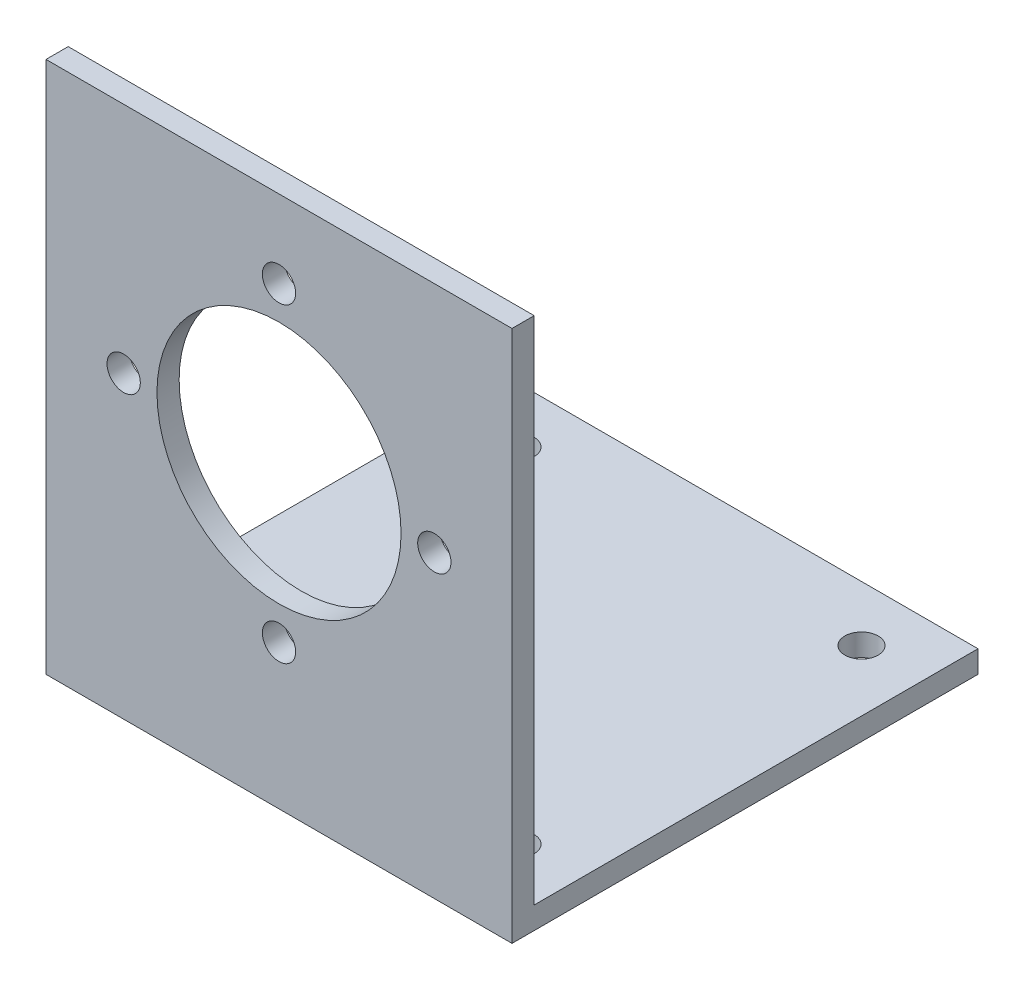
ISO-10303-21;
HEADER;
FILE_DESCRIPTION(('STEP AP214'),'2;1');
FILE_NAME('part.step','',(''),(''),'','','');
FILE_SCHEMA(('AUTOMOTIVE_DESIGN { 1 0 10303 214 1 1 1 1 }'));
ENDSEC;
DATA;
#1=APPLICATION_CONTEXT('core data for automotive mechanical design processes');
#2=APPLICATION_PROTOCOL_DEFINITION('international standard','automotive_design',2000,#1);
#3=PRODUCT_CONTEXT('',#1,'mechanical');
#4=PRODUCT('Part','Part','',(#3));
#5=PRODUCT_RELATED_PRODUCT_CATEGORY('part','',(#4));
#6=PRODUCT_DEFINITION_FORMATION('','',#4);
#7=PRODUCT_DEFINITION_CONTEXT('part definition',#1,'design');
#8=PRODUCT_DEFINITION('design','',#6,#7);
#9=PRODUCT_DEFINITION_SHAPE('','',#8);
#10=(LENGTH_UNIT() NAMED_UNIT(*) SI_UNIT(.MILLI.,.METRE.));
#11=(NAMED_UNIT(*) PLANE_ANGLE_UNIT() SI_UNIT($,.RADIAN.));
#12=(NAMED_UNIT(*) SI_UNIT($,.STERADIAN.) SOLID_ANGLE_UNIT());
#13=UNCERTAINTY_MEASURE_WITH_UNIT(LENGTH_MEASURE(1.E-05),#10,'distance_accuracy_value','');
#14=(GEOMETRIC_REPRESENTATION_CONTEXT(3) GLOBAL_UNCERTAINTY_ASSIGNED_CONTEXT((#13)) GLOBAL_UNIT_ASSIGNED_CONTEXT((#10,
#11,#12)) REPRESENTATION_CONTEXT('',''));
#15=CARTESIAN_POINT('',(0.,0.,0.));
#16=DIRECTION('',(0.,0.,1.));
#17=DIRECTION('',(1.,0.,0.));
#18=AXIS2_PLACEMENT_3D('',#15,#16,#17);
#19=CARTESIAN_POINT('',(42.,0.,0.));
#20=DIRECTION('',(0.,1.,0.));
#21=DIRECTION('',(0.,0.,1.));
#22=AXIS2_PLACEMENT_3D('',#19,#20,#21);
#23=PLANE('',#22);
#24=CARTESIAN_POINT('',(5.50000000000001,0.,-6.00000000000001));
#25=DIRECTION('',(0.,1.,0.));
#26=DIRECTION('',(0.,0.,1.));
#27=AXIS2_PLACEMENT_3D('',#24,#25,#26);
#28=CIRCLE('',#27,1.5);
#29=CARTESIAN_POINT('',(5.50000000000001,0.,-4.50000000000001));
#30=VERTEX_POINT('',#29);
#31=EDGE_CURVE('E166',#30,#30,#28,.T.);
#32=ORIENTED_EDGE('',*,*,#31,.T.);
#33=EDGE_LOOP('',(#32));
#34=FACE_BOUND('',#33,.T.);
#35=CARTESIAN_POINT('',(36.5,0.,-6.00000000000001));
#36=DIRECTION('',(0.,1.,0.));
#37=DIRECTION('',(0.,0.,1.));
#38=AXIS2_PLACEMENT_3D('',#35,#36,#37);
#39=CIRCLE('',#38,1.5);
#40=CARTESIAN_POINT('',(36.5,0.,-4.5));
#41=VERTEX_POINT('',#40);
#42=EDGE_CURVE('E170',#41,#41,#39,.T.);
#43=ORIENTED_EDGE('',*,*,#42,.T.);
#44=EDGE_LOOP('',(#43));
#45=FACE_BOUND('',#44,.T.);
#46=CARTESIAN_POINT('',(36.5,0.,-37.));
#47=DIRECTION('',(0.,1.,0.));
#48=DIRECTION('',(0.,0.,1.));
#49=AXIS2_PLACEMENT_3D('',#46,#47,#48);
#50=CIRCLE('',#49,1.5);
#51=CARTESIAN_POINT('',(36.5,0.,-35.5));
#52=VERTEX_POINT('',#51);
#53=EDGE_CURVE('E174',#52,#52,#50,.T.);
#54=ORIENTED_EDGE('',*,*,#53,.T.);
#55=EDGE_LOOP('',(#54));
#56=FACE_BOUND('',#55,.T.);
#57=CARTESIAN_POINT('',(5.50000000000001,0.,-37.));
#58=DIRECTION('',(0.,1.,0.));
#59=DIRECTION('',(0.,0.,1.));
#60=AXIS2_PLACEMENT_3D('',#57,#58,#59);
#61=CIRCLE('',#60,1.5);
#62=CARTESIAN_POINT('',(5.50000000000001,0.,-35.5));
#63=VERTEX_POINT('',#62);
#64=EDGE_CURVE('E177',#63,#63,#61,.T.);
#65=ORIENTED_EDGE('',*,*,#64,.T.);
#66=EDGE_LOOP('',(#65));
#67=FACE_BOUND('',#66,.T.);
#68=DIRECTION('',(0.,0.,-1.));
#69=VECTOR('',#68,1.);
#70=CARTESIAN_POINT('',(0.,0.,0.));
#71=LINE('',#70,#69);
#72=CARTESIAN_POINT('',(0.,0.,0.));
#73=VERTEX_POINT('',#72);
#74=CARTESIAN_POINT('',(0.,0.,-42.));
#75=VERTEX_POINT('',#74);
#76=EDGE_CURVE('E120',#73,#75,#71,.T.);
#77=ORIENTED_EDGE('',*,*,#76,.T.);
#78=DIRECTION('',(-1.,0.,0.));
#79=VECTOR('',#78,1.);
#80=CARTESIAN_POINT('',(42.,0.,-42.));
#81=LINE('',#80,#79);
#82=CARTESIAN_POINT('',(42.,0.,-42.));
#83=VERTEX_POINT('',#82);
#84=EDGE_CURVE('E11',#83,#75,#81,.T.);
#85=ORIENTED_EDGE('',*,*,#84,.F.);
#86=DIRECTION('',(0.,0.,-1.));
#87=VECTOR('',#86,1.);
#88=CARTESIAN_POINT('',(42.,0.,0.));
#89=LINE('',#88,#87);
#90=CARTESIAN_POINT('',(42.,0.,0.));
#91=VERTEX_POINT('',#90);
#92=EDGE_CURVE('E135',#91,#83,#89,.T.);
#93=ORIENTED_EDGE('',*,*,#92,.F.);
#94=DIRECTION('',(-1.,0.,0.));
#95=VECTOR('',#94,1.);
#96=CARTESIAN_POINT('',(42.,0.,0.));
#97=LINE('',#96,#95);
#98=EDGE_CURVE('E52',#91,#73,#97,.T.);
#99=ORIENTED_EDGE('',*,*,#98,.T.);
#100=EDGE_LOOP('',(#77,#85,#93,#99));
#101=FACE_BOUND('',#100,.T.);
#102=ADVANCED_FACE('F36',(#34,#45,#56,#67,#101),#23,.F.);
#103=CARTESIAN_POINT('',(42.,0.,-42.));
#104=DIRECTION('',(0.,0.,1.));
#105=DIRECTION('',(1.,0.,0.));
#106=AXIS2_PLACEMENT_3D('',#103,#104,#105);
#107=PLANE('',#106);
#108=DIRECTION('',(0.,1.,0.));
#109=VECTOR('',#108,1.);
#110=CARTESIAN_POINT('',(0.,0.,-42.));
#111=LINE('',#110,#109);
#112=CARTESIAN_POINT('',(0.,2.,-42.));
#113=VERTEX_POINT('',#112);
#114=EDGE_CURVE('E122',#75,#113,#111,.T.);
#115=ORIENTED_EDGE('',*,*,#114,.T.);
#116=DIRECTION('',(-1.,0.,0.));
#117=VECTOR('',#116,1.);
#118=CARTESIAN_POINT('',(42.,2.,-42.));
#119=LINE('',#118,#117);
#120=CARTESIAN_POINT('',(42.,2.,-42.));
#121=VERTEX_POINT('',#120);
#122=EDGE_CURVE('E44',#121,#113,#119,.T.);
#123=ORIENTED_EDGE('',*,*,#122,.F.);
#124=DIRECTION('',(0.,1.,0.));
#125=VECTOR('',#124,1.);
#126=CARTESIAN_POINT('',(42.,0.,-42.));
#127=LINE('',#126,#125);
#128=EDGE_CURVE('E84',#83,#121,#127,.T.);
#129=ORIENTED_EDGE('',*,*,#128,.F.);
#130=ORIENTED_EDGE('',*,*,#84,.T.);
#131=EDGE_LOOP('',(#115,#123,#129,#130));
#132=FACE_BOUND('',#131,.T.);
#133=ADVANCED_FACE('F141',(#132),#107,.F.);
#134=CARTESIAN_POINT('',(42.,2.,0.));
#135=DIRECTION('',(0.,1.,0.));
#136=DIRECTION('',(0.,0.,1.));
#137=AXIS2_PLACEMENT_3D('',#134,#135,#136);
#138=PLANE('',#137);
#139=CARTESIAN_POINT('',(5.50000000000001,2.,-6.00000000000001));
#140=DIRECTION('',(0.,1.,0.));
#141=DIRECTION('',(0.,0.,1.));
#142=AXIS2_PLACEMENT_3D('',#139,#140,#141);
#143=CIRCLE('',#142,1.5);
#144=CARTESIAN_POINT('',(5.50000000000001,2.,-4.50000000000001));
#145=VERTEX_POINT('',#144);
#146=EDGE_CURVE('E222',#145,#145,#143,.T.);
#147=ORIENTED_EDGE('',*,*,#146,.F.);
#148=EDGE_LOOP('',(#147));
#149=FACE_BOUND('',#148,.T.);
#150=CARTESIAN_POINT('',(36.5,2.,-6.00000000000001));
#151=DIRECTION('',(0.,1.,0.));
#152=DIRECTION('',(0.,0.,1.));
#153=AXIS2_PLACEMENT_3D('',#150,#151,#152);
#154=CIRCLE('',#153,1.5);
#155=CARTESIAN_POINT('',(36.5,2.,-4.5));
#156=VERTEX_POINT('',#155);
#157=EDGE_CURVE('E218',#156,#156,#154,.T.);
#158=ORIENTED_EDGE('',*,*,#157,.F.);
#159=EDGE_LOOP('',(#158));
#160=FACE_BOUND('',#159,.T.);
#161=CARTESIAN_POINT('',(36.5,2.,-37.));
#162=DIRECTION('',(0.,1.,0.));
#163=DIRECTION('',(0.,0.,1.));
#164=AXIS2_PLACEMENT_3D('',#161,#162,#163);
#165=CIRCLE('',#164,1.5);
#166=CARTESIAN_POINT('',(36.5,2.,-35.5));
#167=VERTEX_POINT('',#166);
#168=EDGE_CURVE('E214',#167,#167,#165,.T.);
#169=ORIENTED_EDGE('',*,*,#168,.F.);
#170=EDGE_LOOP('',(#169));
#171=FACE_BOUND('',#170,.T.);
#172=CARTESIAN_POINT('',(5.50000000000001,2.,-37.));
#173=DIRECTION('',(0.,1.,0.));
#174=DIRECTION('',(0.,0.,1.));
#175=AXIS2_PLACEMENT_3D('',#172,#173,#174);
#176=CIRCLE('',#175,1.5);
#177=CARTESIAN_POINT('',(5.50000000000001,2.,-35.5));
#178=VERTEX_POINT('',#177);
#179=EDGE_CURVE('E210',#178,#178,#176,.T.);
#180=ORIENTED_EDGE('',*,*,#179,.F.);
#181=EDGE_LOOP('',(#180));
#182=FACE_BOUND('',#181,.T.);
#183=DIRECTION('',(0.,0.,-1.));
#184=VECTOR('',#183,1.);
#185=CARTESIAN_POINT('',(0.,2.,0.));
#186=LINE('',#185,#184);
#187=CARTESIAN_POINT('',(0.,2.,-2.));
#188=VERTEX_POINT('',#187);
#189=EDGE_CURVE('E126',#188,#113,#186,.T.);
#190=ORIENTED_EDGE('',*,*,#189,.F.);
#191=DIRECTION('',(-1.,0.,0.));
#192=VECTOR('',#191,1.);
#193=CARTESIAN_POINT('',(42.,2.,-2.));
#194=LINE('',#193,#192);
#195=CARTESIAN_POINT('',(42.,2.,-2.));
#196=VERTEX_POINT('',#195);
#197=EDGE_CURVE('E112',#196,#188,#194,.T.);
#198=ORIENTED_EDGE('',*,*,#197,.F.);
#199=DIRECTION('',(0.,0.,-1.));
#200=VECTOR('',#199,1.);
#201=CARTESIAN_POINT('',(42.,2.,0.));
#202=LINE('',#201,#200);
#203=EDGE_CURVE('E102',#196,#121,#202,.T.);
#204=ORIENTED_EDGE('',*,*,#203,.T.);
#205=ORIENTED_EDGE('',*,*,#122,.T.);
#206=EDGE_LOOP('',(#190,#198,#204,#205));
#207=FACE_BOUND('',#206,.T.);
#208=ADVANCED_FACE('F140',(#149,#160,#171,#182,#207),#138,.T.);
#209=CARTESIAN_POINT('',(42.,0.,-2.));
#210=DIRECTION('',(0.,0.,1.));
#211=DIRECTION('',(0.,-1.,0.));
#212=AXIS2_PLACEMENT_3D('',#209,#210,#211);
#213=PLANE('',#212);
#214=CARTESIAN_POINT('',(7.,27.,-2.00000000000001));
#215=DIRECTION('',(0.,0.,1.));
#216=DIRECTION('',(0.,-1.,0.));
#217=AXIS2_PLACEMENT_3D('',#214,#215,#216);
#218=CIRCLE('',#217,1.5);
#219=CARTESIAN_POINT('',(8.5,27.,-2.00000000000002));
#220=VERTEX_POINT('',#219);
#221=EDGE_CURVE('E204',#220,#220,#218,.T.);
#222=ORIENTED_EDGE('',*,*,#221,.T.);
#223=EDGE_LOOP('',(#222));
#224=FACE_BOUND('',#223,.T.);
#225=CARTESIAN_POINT('',(35.,27.,-2.00000000000001));
#226=DIRECTION('',(0.,0.,1.));
#227=DIRECTION('',(0.,-1.,0.));
#228=AXIS2_PLACEMENT_3D('',#225,#226,#227);
#229=CIRCLE('',#228,1.5);
#230=CARTESIAN_POINT('',(36.5,27.,-2.00000000000002));
#231=VERTEX_POINT('',#230);
#232=EDGE_CURVE('E198',#231,#231,#229,.T.);
#233=ORIENTED_EDGE('',*,*,#232,.T.);
#234=EDGE_LOOP('',(#233));
#235=FACE_BOUND('',#234,.T.);
#236=CARTESIAN_POINT('',(21.,13.,-2.00000000000001));
#237=DIRECTION('',(0.,0.,1.));
#238=DIRECTION('',(0.,-1.,0.));
#239=AXIS2_PLACEMENT_3D('',#236,#237,#238);
#240=CIRCLE('',#239,1.5);
#241=CARTESIAN_POINT('',(22.5,13.,-2.00000000000002));
#242=VERTEX_POINT('',#241);
#243=EDGE_CURVE('E192',#242,#242,#240,.T.);
#244=ORIENTED_EDGE('',*,*,#243,.T.);
#245=EDGE_LOOP('',(#244));
#246=FACE_BOUND('',#245,.T.);
#247=CARTESIAN_POINT('',(21.,41.,-2.00000000000001));
#248=DIRECTION('',(0.,0.,1.));
#249=DIRECTION('',(0.,-1.,0.));
#250=AXIS2_PLACEMENT_3D('',#247,#248,#249);
#251=CIRCLE('',#250,1.5);
#252=CARTESIAN_POINT('',(22.5,41.,-2.00000000000002));
#253=VERTEX_POINT('',#252);
#254=EDGE_CURVE('E184',#253,#253,#251,.T.);
#255=ORIENTED_EDGE('',*,*,#254,.T.);
#256=EDGE_LOOP('',(#255));
#257=FACE_BOUND('',#256,.T.);
#258=CARTESIAN_POINT('',(21.,27.,-2.));
#259=DIRECTION('',(0.,0.,-1.));
#260=DIRECTION('',(0.,1.,0.));
#261=AXIS2_PLACEMENT_3D('',#258,#259,#260);
#262=CIRCLE('',#261,11.);
#263=CARTESIAN_POINT('',(21.,38.,-2.));
#264=VERTEX_POINT('',#263);
#265=EDGE_CURVE('E181',#264,#264,#262,.T.);
#266=ORIENTED_EDGE('',*,*,#265,.F.);
#267=EDGE_LOOP('',(#266));
#268=FACE_BOUND('',#267,.T.);
#269=DIRECTION('',(0.,1.,0.));
#270=VECTOR('',#269,1.);
#271=CARTESIAN_POINT('',(0.,0.,-2.));
#272=LINE('',#271,#270);
#273=CARTESIAN_POINT('',(0.,48.,-2.));
#274=VERTEX_POINT('',#273);
#275=EDGE_CURVE('E109',#188,#274,#272,.T.);
#276=ORIENTED_EDGE('',*,*,#275,.T.);
#277=DIRECTION('',(-1.,0.,0.));
#278=VECTOR('',#277,1.);
#279=CARTESIAN_POINT('',(42.,48.,-2.));
#280=LINE('',#279,#278);
#281=CARTESIAN_POINT('',(42.,48.,-2.));
#282=VERTEX_POINT('',#281);
#283=EDGE_CURVE('E106',#282,#274,#280,.T.);
#284=ORIENTED_EDGE('',*,*,#283,.F.);
#285=DIRECTION('',(0.,1.,0.));
#286=VECTOR('',#285,1.);
#287=CARTESIAN_POINT('',(42.,0.,-2.));
#288=LINE('',#287,#286);
#289=EDGE_CURVE('E95',#196,#282,#288,.T.);
#290=ORIENTED_EDGE('',*,*,#289,.F.);
#291=ORIENTED_EDGE('',*,*,#197,.T.);
#292=EDGE_LOOP('',(#276,#284,#290,#291));
#293=FACE_BOUND('',#292,.T.);
#294=ADVANCED_FACE('F107',(#224,#235,#246,#257,#268,#293),#213,.F.);
#295=CARTESIAN_POINT('',(42.,48.,0.));
#296=DIRECTION('',(0.,1.,0.));
#297=DIRECTION('',(0.,0.,1.));
#298=AXIS2_PLACEMENT_3D('',#295,#296,#297);
#299=PLANE('',#298);
#300=DIRECTION('',(0.,0.,-1.));
#301=VECTOR('',#300,1.);
#302=CARTESIAN_POINT('',(0.,48.,0.));
#303=LINE('',#302,#301);
#304=CARTESIAN_POINT('',(0.,48.,0.));
#305=VERTEX_POINT('',#304);
#306=EDGE_CURVE('E130',#305,#274,#303,.T.);
#307=ORIENTED_EDGE('',*,*,#306,.F.);
#308=DIRECTION('',(-1.,0.,0.));
#309=VECTOR('',#308,1.);
#310=CARTESIAN_POINT('',(42.,48.,0.));
#311=LINE('',#310,#309);
#312=CARTESIAN_POINT('',(42.,48.,0.));
#313=VERTEX_POINT('',#312);
#314=EDGE_CURVE('E72',#313,#305,#311,.T.);
#315=ORIENTED_EDGE('',*,*,#314,.F.);
#316=DIRECTION('',(0.,0.,-1.));
#317=VECTOR('',#316,1.);
#318=CARTESIAN_POINT('',(42.,48.,0.));
#319=LINE('',#318,#317);
#320=EDGE_CURVE('E100',#313,#282,#319,.T.);
#321=ORIENTED_EDGE('',*,*,#320,.T.);
#322=ORIENTED_EDGE('',*,*,#283,.T.);
#323=EDGE_LOOP('',(#307,#315,#321,#322));
#324=FACE_BOUND('',#323,.T.);
#325=ADVANCED_FACE('F114',(#324),#299,.T.);
#326=CARTESIAN_POINT('',(42.,0.,0.));
#327=DIRECTION('',(0.,0.,1.));
#328=DIRECTION('',(1.,0.,0.));
#329=AXIS2_PLACEMENT_3D('',#326,#327,#328);
#330=PLANE('',#329);
#331=CARTESIAN_POINT('',(7.,27.,0.));
#332=DIRECTION('',(0.,0.,1.));
#333=DIRECTION('',(1.,0.,0.));
#334=AXIS2_PLACEMENT_3D('',#331,#332,#333);
#335=CIRCLE('',#334,1.5);
#336=CARTESIAN_POINT('',(8.5,27.,0.));
#337=VERTEX_POINT('',#336);
#338=EDGE_CURVE('E207',#337,#337,#335,.T.);
#339=ORIENTED_EDGE('',*,*,#338,.F.);
#340=EDGE_LOOP('',(#339));
#341=FACE_BOUND('',#340,.T.);
#342=CARTESIAN_POINT('',(35.,27.,0.));
#343=DIRECTION('',(0.,0.,1.));
#344=DIRECTION('',(1.,0.,0.));
#345=AXIS2_PLACEMENT_3D('',#342,#343,#344);
#346=CIRCLE('',#345,1.5);
#347=CARTESIAN_POINT('',(36.5,27.,0.));
#348=VERTEX_POINT('',#347);
#349=EDGE_CURVE('E201',#348,#348,#346,.T.);
#350=ORIENTED_EDGE('',*,*,#349,.F.);
#351=EDGE_LOOP('',(#350));
#352=FACE_BOUND('',#351,.T.);
#353=CARTESIAN_POINT('',(21.,13.,0.));
#354=DIRECTION('',(0.,0.,1.));
#355=DIRECTION('',(1.,0.,0.));
#356=AXIS2_PLACEMENT_3D('',#353,#354,#355);
#357=CIRCLE('',#356,1.5);
#358=CARTESIAN_POINT('',(22.5,13.,0.));
#359=VERTEX_POINT('',#358);
#360=EDGE_CURVE('E195',#359,#359,#357,.T.);
#361=ORIENTED_EDGE('',*,*,#360,.F.);
#362=EDGE_LOOP('',(#361));
#363=FACE_BOUND('',#362,.T.);
#364=CARTESIAN_POINT('',(21.,41.,0.));
#365=DIRECTION('',(0.,0.,1.));
#366=DIRECTION('',(1.,0.,0.));
#367=AXIS2_PLACEMENT_3D('',#364,#365,#366);
#368=CIRCLE('',#367,1.5);
#369=CARTESIAN_POINT('',(22.5,41.,0.));
#370=VERTEX_POINT('',#369);
#371=EDGE_CURVE('E189',#370,#370,#368,.T.);
#372=ORIENTED_EDGE('',*,*,#371,.F.);
#373=EDGE_LOOP('',(#372));
#374=FACE_BOUND('',#373,.T.);
#375=CARTESIAN_POINT('',(21.,27.,0.));
#376=DIRECTION('',(0.,0.,-1.));
#377=DIRECTION('',(0.,1.,0.));
#378=AXIS2_PLACEMENT_3D('',#375,#376,#377);
#379=CIRCLE('',#378,11.);
#380=CARTESIAN_POINT('',(21.,38.,0.));
#381=VERTEX_POINT('',#380);
#382=EDGE_CURVE('E123',#381,#381,#379,.T.);
#383=ORIENTED_EDGE('',*,*,#382,.T.);
#384=EDGE_LOOP('',(#383));
#385=FACE_BOUND('',#384,.T.);
#386=DIRECTION('',(0.,1.,0.));
#387=VECTOR('',#386,1.);
#388=CARTESIAN_POINT('',(0.,0.,0.));
#389=LINE('',#388,#387);
#390=EDGE_CURVE('E132',#73,#305,#389,.T.);
#391=ORIENTED_EDGE('',*,*,#390,.F.);
#392=ORIENTED_EDGE('',*,*,#98,.F.);
#393=DIRECTION('',(0.,1.,0.));
#394=VECTOR('',#393,1.);
#395=CARTESIAN_POINT('',(42.,0.,0.));
#396=LINE('',#395,#394);
#397=EDGE_CURVE('E115',#91,#313,#396,.T.);
#398=ORIENTED_EDGE('',*,*,#397,.T.);
#399=ORIENTED_EDGE('',*,*,#314,.T.);
#400=EDGE_LOOP('',(#391,#392,#398,#399));
#401=FACE_BOUND('',#400,.T.);
#402=ADVANCED_FACE('F145',(#341,#352,#363,#374,#385,#401),#330,.T.);
#403=CARTESIAN_POINT('',(42.,0.,0.));
#404=DIRECTION('',(1.,0.,0.));
#405=DIRECTION('',(0.,0.,-1.));
#406=AXIS2_PLACEMENT_3D('',#403,#404,#405);
#407=PLANE('',#406);
#408=ORIENTED_EDGE('',*,*,#92,.T.);
#409=ORIENTED_EDGE('',*,*,#128,.T.);
#410=ORIENTED_EDGE('',*,*,#203,.F.);
#411=ORIENTED_EDGE('',*,*,#289,.T.);
#412=ORIENTED_EDGE('',*,*,#320,.F.);
#413=ORIENTED_EDGE('',*,*,#397,.F.);
#414=EDGE_LOOP('',(#408,#409,#410,#411,#412,#413));
#415=FACE_BOUND('',#414,.T.);
#416=ADVANCED_FACE('F97',(#415),#407,.T.);
#417=CARTESIAN_POINT('',(0.,0.,0.));
#418=DIRECTION('',(1.,0.,0.));
#419=DIRECTION('',(0.,0.,-1.));
#420=AXIS2_PLACEMENT_3D('',#417,#418,#419);
#421=PLANE('',#420);
#422=ORIENTED_EDGE('',*,*,#76,.F.);
#423=ORIENTED_EDGE('',*,*,#390,.T.);
#424=ORIENTED_EDGE('',*,*,#306,.T.);
#425=ORIENTED_EDGE('',*,*,#275,.F.);
#426=ORIENTED_EDGE('',*,*,#189,.T.);
#427=ORIENTED_EDGE('',*,*,#114,.F.);
#428=EDGE_LOOP('',(#422,#423,#424,#425,#426,#427));
#429=FACE_BOUND('',#428,.T.);
#430=ADVANCED_FACE('F144',(#429),#421,.F.);
#431=CARTESIAN_POINT('',(21.,27.,0.));
#432=DIRECTION('',(0.,0.,-1.));
#433=DIRECTION('',(0.,1.,0.));
#434=AXIS2_PLACEMENT_3D('',#431,#432,#433);
#435=CYLINDRICAL_SURFACE('',#434,11.);
#436=ORIENTED_EDGE('',*,*,#382,.F.);
#437=EDGE_LOOP('',(#436));
#438=FACE_BOUND('',#437,.T.);
#439=ORIENTED_EDGE('',*,*,#265,.T.);
#440=EDGE_LOOP('',(#439));
#441=FACE_BOUND('',#440,.T.);
#442=ADVANCED_FACE('F266',(#438,#441),#435,.F.);
#443=CARTESIAN_POINT('',(21.,41.,-42.));
#444=DIRECTION('',(0.,0.,1.));
#445=DIRECTION('',(1.,0.,0.));
#446=AXIS2_PLACEMENT_3D('',#443,#444,#445);
#447=CYLINDRICAL_SURFACE('',#446,1.5);
#448=CARTESIAN_POINT('',(22.5,41.,0.));
#449=CARTESIAN_POINT('',(22.5,41.,-0.0208333333333333));
#450=CARTESIAN_POINT('',(22.5,41.,-0.0416666666666667));
#451=CARTESIAN_POINT('',(22.5,41.,-0.0833333333333334));
#452=CARTESIAN_POINT('',(22.5,41.,-0.104166666666667));
#453=CARTESIAN_POINT('',(22.5,41.,-0.145833333333333));
#454=CARTESIAN_POINT('',(22.5,41.,-0.166666666666667));
#455=CARTESIAN_POINT('',(22.5,41.,-0.208333333333334));
#456=CARTESIAN_POINT('',(22.5,41.,-0.229166666666667));
#457=CARTESIAN_POINT('',(22.5,41.,-0.270833333333334));
#458=CARTESIAN_POINT('',(22.5,41.,-0.291666666666667));
#459=CARTESIAN_POINT('',(22.5,41.,-0.333333333333334));
#460=CARTESIAN_POINT('',(22.5,41.,-0.354166666666667));
#461=CARTESIAN_POINT('',(22.5,41.,-0.395833333333334));
#462=CARTESIAN_POINT('',(22.5,41.,-0.416666666666667));
#463=CARTESIAN_POINT('',(22.5,41.,-0.458333333333334));
#464=CARTESIAN_POINT('',(22.5,41.,-0.479166666666667));
#465=CARTESIAN_POINT('',(22.5,41.,-0.520833333333336));
#466=CARTESIAN_POINT('',(22.5,41.,-0.541666666666672));
#467=CARTESIAN_POINT('',(22.5,41.,-0.583333333333341));
#468=CARTESIAN_POINT('',(22.5,41.,-0.604166666666674));
#469=CARTESIAN_POINT('',(22.5,41.,-0.645833333333341));
#470=CARTESIAN_POINT('',(22.5,41.,-0.666666666666674));
#471=CARTESIAN_POINT('',(22.5,41.,-0.708333333333341));
#472=CARTESIAN_POINT('',(22.5,41.,-0.729166666666674));
#473=CARTESIAN_POINT('',(22.5,41.,-0.770833333333341));
#474=CARTESIAN_POINT('',(22.5,41.,-0.791666666666674));
#475=CARTESIAN_POINT('',(22.5,41.,-0.833333333333341));
#476=CARTESIAN_POINT('',(22.5,41.,-0.854166666666674));
#477=CARTESIAN_POINT('',(22.5,41.,-0.895833333333341));
#478=CARTESIAN_POINT('',(22.5,41.,-0.916666666666674));
#479=CARTESIAN_POINT('',(22.5,41.,-0.958333333333341));
#480=CARTESIAN_POINT('',(22.5,41.,-0.979166666666674));
#481=CARTESIAN_POINT('',(22.5,41.,-1.02083333333334));
#482=CARTESIAN_POINT('',(22.5,41.,-1.04166666666667));
#483=CARTESIAN_POINT('',(22.5,41.,-1.08333333333334));
#484=CARTESIAN_POINT('',(22.5,41.,-1.10416666666667));
#485=CARTESIAN_POINT('',(22.5,41.,-1.14583333333334));
#486=CARTESIAN_POINT('',(22.5,41.,-1.16666666666667));
#487=CARTESIAN_POINT('',(22.5,41.,-1.20833333333334));
#488=CARTESIAN_POINT('',(22.5,41.,-1.22916666666667));
#489=CARTESIAN_POINT('',(22.5,41.,-1.27083333333334));
#490=CARTESIAN_POINT('',(22.5,41.,-1.29166666666667));
#491=CARTESIAN_POINT('',(22.5,41.,-1.33333333333334));
#492=CARTESIAN_POINT('',(22.5,41.,-1.35416666666667));
#493=CARTESIAN_POINT('',(22.5,41.,-1.39583333333334));
#494=CARTESIAN_POINT('',(22.5,41.,-1.41666666666667));
#495=CARTESIAN_POINT('',(22.5,41.,-1.45833333333334));
#496=CARTESIAN_POINT('',(22.5,41.,-1.47916666666668));
#497=CARTESIAN_POINT('',(22.5,41.,-1.52083333333335));
#498=CARTESIAN_POINT('',(22.5,41.,-1.54166666666668));
#499=CARTESIAN_POINT('',(22.5,41.,-1.58333333333335));
#500=CARTESIAN_POINT('',(22.5,41.,-1.60416666666668));
#501=CARTESIAN_POINT('',(22.5,41.,-1.64583333333335));
#502=CARTESIAN_POINT('',(22.5,41.,-1.66666666666668));
#503=CARTESIAN_POINT('',(22.5,41.,-1.70833333333335));
#504=CARTESIAN_POINT('',(22.5,41.,-1.72916666666668));
#505=CARTESIAN_POINT('',(22.5,41.,-1.77083333333335));
#506=CARTESIAN_POINT('',(22.5,41.,-1.79166666666668));
#507=CARTESIAN_POINT('',(22.5,41.,-1.83333333333335));
#508=CARTESIAN_POINT('',(22.5,41.,-1.85416666666668));
#509=CARTESIAN_POINT('',(22.5,41.,-1.89583333333335));
#510=CARTESIAN_POINT('',(22.5,41.,-1.91666666666668));
#511=CARTESIAN_POINT('',(22.5,41.,-1.95833333333335));
#512=CARTESIAN_POINT('',(22.5,41.,-1.97916666666668));
#513=CARTESIAN_POINT('',(22.5,41.,-2.00000000000002));
#514=B_SPLINE_CURVE_WITH_KNOTS('',3,(#448,#449,#450,#451,#452,#453,#454,#455,#456,#457,#458,
#459,#460,#461,#462,#463,#464,#465,#466,#467,#468,#469,#470,#471,#472,#473,#474,#475,#476,#477,
#478,#479,#480,#481,#482,#483,#484,#485,#486,#487,#488,#489,#490,#491,#492,#493,#494,#495,#496,
#497,#498,#499,#500,#501,#502,#503,#504,#505,#506,#507,#508,#509,#510,#511,#512,#513),
.UNSPECIFIED.,.F.,.F.,(4,2,2,2,2,2,2,2,2,2,2,2,2,2,2,2,2,2,2,2,2,2,2,2,2,2,2,2,2,2,2,2,4),(0.,
0.0625000000000001,0.125,0.1875,0.25,0.3125,0.375,0.4375,0.5,0.562500000000007,
0.625000000000008,0.687500000000008,0.750000000000008,0.812500000000008,0.875000000000008,
0.937500000000008,1.00000000000001,1.06250000000001,1.12500000000001,1.18750000000001,
1.25000000000001,1.31250000000001,1.37500000000001,1.43750000000001,1.50000000000002,
1.56250000000002,1.62500000000002,1.68750000000002,1.75000000000002,1.81250000000002,
1.87500000000002,1.93750000000002,2.00000000000002),.UNSPECIFIED.);
#515=EDGE_CURVE('BSEAM262',#370,#253,#514,.T.);
#516=ORIENTED_EDGE('',*,*,#371,.T.);
#517=ORIENTED_EDGE('',*,*,#254,.F.);
#518=ORIENTED_EDGE('',*,*,#515,.T.);
#519=ORIENTED_EDGE('',*,*,#515,.F.);
#520=EDGE_LOOP('',(#516,#518,#517,#519));
#521=FACE_BOUND('',#520,.T.);
#522=ADVANCED_FACE('F262',(#521),#447,.F.);
#523=CARTESIAN_POINT('',(21.,13.,-42.));
#524=DIRECTION('',(0.,0.,1.));
#525=DIRECTION('',(1.,0.,0.));
#526=AXIS2_PLACEMENT_3D('',#523,#524,#525);
#527=CYLINDRICAL_SURFACE('',#526,1.5);
#528=CARTESIAN_POINT('',(22.5,13.,0.));
#529=CARTESIAN_POINT('',(22.5,13.,-0.0208333333333333));
#530=CARTESIAN_POINT('',(22.5,13.,-0.0416666666666667));
#531=CARTESIAN_POINT('',(22.5,13.,-0.0833333333333334));
#532=CARTESIAN_POINT('',(22.5,13.,-0.104166666666667));
#533=CARTESIAN_POINT('',(22.5,13.,-0.145833333333333));
#534=CARTESIAN_POINT('',(22.5,13.,-0.166666666666667));
#535=CARTESIAN_POINT('',(22.5,13.,-0.208333333333334));
#536=CARTESIAN_POINT('',(22.5,13.,-0.229166666666667));
#537=CARTESIAN_POINT('',(22.5,13.,-0.270833333333334));
#538=CARTESIAN_POINT('',(22.5,13.,-0.291666666666667));
#539=CARTESIAN_POINT('',(22.5,13.,-0.333333333333334));
#540=CARTESIAN_POINT('',(22.5,13.,-0.354166666666667));
#541=CARTESIAN_POINT('',(22.5,13.,-0.395833333333334));
#542=CARTESIAN_POINT('',(22.5,13.,-0.416666666666667));
#543=CARTESIAN_POINT('',(22.5,13.,-0.458333333333334));
#544=CARTESIAN_POINT('',(22.5,13.,-0.479166666666667));
#545=CARTESIAN_POINT('',(22.5,13.,-0.520833333333336));
#546=CARTESIAN_POINT('',(22.5,13.,-0.541666666666672));
#547=CARTESIAN_POINT('',(22.5,13.,-0.583333333333341));
#548=CARTESIAN_POINT('',(22.5,13.,-0.604166666666674));
#549=CARTESIAN_POINT('',(22.5,13.,-0.645833333333341));
#550=CARTESIAN_POINT('',(22.5,13.,-0.666666666666674));
#551=CARTESIAN_POINT('',(22.5,13.,-0.708333333333341));
#552=CARTESIAN_POINT('',(22.5,13.,-0.729166666666674));
#553=CARTESIAN_POINT('',(22.5,13.,-0.770833333333341));
#554=CARTESIAN_POINT('',(22.5,13.,-0.791666666666674));
#555=CARTESIAN_POINT('',(22.5,13.,-0.833333333333341));
#556=CARTESIAN_POINT('',(22.5,13.,-0.854166666666674));
#557=CARTESIAN_POINT('',(22.5,13.,-0.895833333333341));
#558=CARTESIAN_POINT('',(22.5,13.,-0.916666666666674));
#559=CARTESIAN_POINT('',(22.5,13.,-0.958333333333341));
#560=CARTESIAN_POINT('',(22.5,13.,-0.979166666666674));
#561=CARTESIAN_POINT('',(22.5,13.,-1.02083333333334));
#562=CARTESIAN_POINT('',(22.5,13.,-1.04166666666667));
#563=CARTESIAN_POINT('',(22.5,13.,-1.08333333333334));
#564=CARTESIAN_POINT('',(22.5,13.,-1.10416666666667));
#565=CARTESIAN_POINT('',(22.5,13.,-1.14583333333334));
#566=CARTESIAN_POINT('',(22.5,13.,-1.16666666666667));
#567=CARTESIAN_POINT('',(22.5,13.,-1.20833333333334));
#568=CARTESIAN_POINT('',(22.5,13.,-1.22916666666667));
#569=CARTESIAN_POINT('',(22.5,13.,-1.27083333333334));
#570=CARTESIAN_POINT('',(22.5,13.,-1.29166666666667));
#571=CARTESIAN_POINT('',(22.5,13.,-1.33333333333334));
#572=CARTESIAN_POINT('',(22.5,13.,-1.35416666666667));
#573=CARTESIAN_POINT('',(22.5,13.,-1.39583333333334));
#574=CARTESIAN_POINT('',(22.5,13.,-1.41666666666667));
#575=CARTESIAN_POINT('',(22.5,13.,-1.45833333333334));
#576=CARTESIAN_POINT('',(22.5,13.,-1.47916666666668));
#577=CARTESIAN_POINT('',(22.5,13.,-1.52083333333335));
#578=CARTESIAN_POINT('',(22.5,13.,-1.54166666666668));
#579=CARTESIAN_POINT('',(22.5,13.,-1.58333333333335));
#580=CARTESIAN_POINT('',(22.5,13.,-1.60416666666668));
#581=CARTESIAN_POINT('',(22.5,13.,-1.64583333333335));
#582=CARTESIAN_POINT('',(22.5,13.,-1.66666666666668));
#583=CARTESIAN_POINT('',(22.5,13.,-1.70833333333335));
#584=CARTESIAN_POINT('',(22.5,13.,-1.72916666666668));
#585=CARTESIAN_POINT('',(22.5,13.,-1.77083333333335));
#586=CARTESIAN_POINT('',(22.5,13.,-1.79166666666668));
#587=CARTESIAN_POINT('',(22.5,13.,-1.83333333333335));
#588=CARTESIAN_POINT('',(22.5,13.,-1.85416666666668));
#589=CARTESIAN_POINT('',(22.5,13.,-1.89583333333335));
#590=CARTESIAN_POINT('',(22.5,13.,-1.91666666666668));
#591=CARTESIAN_POINT('',(22.5,13.,-1.95833333333335));
#592=CARTESIAN_POINT('',(22.5,13.,-1.97916666666668));
#593=CARTESIAN_POINT('',(22.5,13.,-2.00000000000002));
#594=B_SPLINE_CURVE_WITH_KNOTS('',3,(#528,#529,#530,#531,#532,#533,#534,#535,#536,#537,#538,
#539,#540,#541,#542,#543,#544,#545,#546,#547,#548,#549,#550,#551,#552,#553,#554,#555,#556,#557,
#558,#559,#560,#561,#562,#563,#564,#565,#566,#567,#568,#569,#570,#571,#572,#573,#574,#575,#576,
#577,#578,#579,#580,#581,#582,#583,#584,#585,#586,#587,#588,#589,#590,#591,#592,#593),
.UNSPECIFIED.,.F.,.F.,(4,2,2,2,2,2,2,2,2,2,2,2,2,2,2,2,2,2,2,2,2,2,2,2,2,2,2,2,2,2,2,2,4),(0.,
0.0625000000000001,0.125,0.1875,0.25,0.3125,0.375,0.4375,0.5,0.562500000000007,
0.625000000000008,0.687500000000008,0.750000000000008,0.812500000000008,0.875000000000008,
0.937500000000008,1.00000000000001,1.06250000000001,1.12500000000001,1.18750000000001,
1.25000000000001,1.31250000000001,1.37500000000001,1.43750000000001,1.50000000000002,
1.56250000000002,1.62500000000002,1.68750000000002,1.75000000000002,1.81250000000002,
1.87500000000002,1.93750000000002,2.00000000000002),.UNSPECIFIED.);
#595=EDGE_CURVE('BSEAM258',#359,#242,#594,.T.);
#596=ORIENTED_EDGE('',*,*,#360,.T.);
#597=ORIENTED_EDGE('',*,*,#243,.F.);
#598=ORIENTED_EDGE('',*,*,#595,.T.);
#599=ORIENTED_EDGE('',*,*,#595,.F.);
#600=EDGE_LOOP('',(#596,#598,#597,#599));
#601=FACE_BOUND('',#600,.T.);
#602=ADVANCED_FACE('F258',(#601),#527,.F.);
#603=CARTESIAN_POINT('',(35.,27.,-42.));
#604=DIRECTION('',(0.,0.,1.));
#605=DIRECTION('',(1.,0.,0.));
#606=AXIS2_PLACEMENT_3D('',#603,#604,#605);
#607=CYLINDRICAL_SURFACE('',#606,1.5);
#608=CARTESIAN_POINT('',(36.5,27.,0.));
#609=CARTESIAN_POINT('',(36.5,27.,-0.0208333333333333));
#610=CARTESIAN_POINT('',(36.5,27.,-0.0416666666666667));
#611=CARTESIAN_POINT('',(36.5,27.,-0.0833333333333334));
#612=CARTESIAN_POINT('',(36.5,27.,-0.104166666666667));
#613=CARTESIAN_POINT('',(36.5,27.,-0.145833333333333));
#614=CARTESIAN_POINT('',(36.5,27.,-0.166666666666667));
#615=CARTESIAN_POINT('',(36.5,27.,-0.208333333333334));
#616=CARTESIAN_POINT('',(36.5,27.,-0.229166666666667));
#617=CARTESIAN_POINT('',(36.5,27.,-0.270833333333334));
#618=CARTESIAN_POINT('',(36.5,27.,-0.291666666666667));
#619=CARTESIAN_POINT('',(36.5,27.,-0.333333333333334));
#620=CARTESIAN_POINT('',(36.5,27.,-0.354166666666667));
#621=CARTESIAN_POINT('',(36.5,27.,-0.395833333333334));
#622=CARTESIAN_POINT('',(36.5,27.,-0.416666666666667));
#623=CARTESIAN_POINT('',(36.5,27.,-0.458333333333334));
#624=CARTESIAN_POINT('',(36.5,27.,-0.479166666666667));
#625=CARTESIAN_POINT('',(36.5,27.,-0.520833333333336));
#626=CARTESIAN_POINT('',(36.5,27.,-0.541666666666672));
#627=CARTESIAN_POINT('',(36.5,27.,-0.583333333333341));
#628=CARTESIAN_POINT('',(36.5,27.,-0.604166666666674));
#629=CARTESIAN_POINT('',(36.5,27.,-0.645833333333341));
#630=CARTESIAN_POINT('',(36.5,27.,-0.666666666666674));
#631=CARTESIAN_POINT('',(36.5,27.,-0.708333333333341));
#632=CARTESIAN_POINT('',(36.5,27.,-0.729166666666674));
#633=CARTESIAN_POINT('',(36.5,27.,-0.770833333333341));
#634=CARTESIAN_POINT('',(36.5,27.,-0.791666666666674));
#635=CARTESIAN_POINT('',(36.5,27.,-0.833333333333341));
#636=CARTESIAN_POINT('',(36.5,27.,-0.854166666666674));
#637=CARTESIAN_POINT('',(36.5,27.,-0.895833333333341));
#638=CARTESIAN_POINT('',(36.5,27.,-0.916666666666674));
#639=CARTESIAN_POINT('',(36.5,27.,-0.958333333333341));
#640=CARTESIAN_POINT('',(36.5,27.,-0.979166666666674));
#641=CARTESIAN_POINT('',(36.5,27.,-1.02083333333334));
#642=CARTESIAN_POINT('',(36.5,27.,-1.04166666666667));
#643=CARTESIAN_POINT('',(36.5,27.,-1.08333333333334));
#644=CARTESIAN_POINT('',(36.5,27.,-1.10416666666667));
#645=CARTESIAN_POINT('',(36.5,27.,-1.14583333333334));
#646=CARTESIAN_POINT('',(36.5,27.,-1.16666666666667));
#647=CARTESIAN_POINT('',(36.5,27.,-1.20833333333334));
#648=CARTESIAN_POINT('',(36.5,27.,-1.22916666666667));
#649=CARTESIAN_POINT('',(36.5,27.,-1.27083333333334));
#650=CARTESIAN_POINT('',(36.5,27.,-1.29166666666667));
#651=CARTESIAN_POINT('',(36.5,27.,-1.33333333333334));
#652=CARTESIAN_POINT('',(36.5,27.,-1.35416666666667));
#653=CARTESIAN_POINT('',(36.5,27.,-1.39583333333334));
#654=CARTESIAN_POINT('',(36.5,27.,-1.41666666666667));
#655=CARTESIAN_POINT('',(36.5,27.,-1.45833333333334));
#656=CARTESIAN_POINT('',(36.5,27.,-1.47916666666668));
#657=CARTESIAN_POINT('',(36.5,27.,-1.52083333333335));
#658=CARTESIAN_POINT('',(36.5,27.,-1.54166666666668));
#659=CARTESIAN_POINT('',(36.5,27.,-1.58333333333335));
#660=CARTESIAN_POINT('',(36.5,27.,-1.60416666666668));
#661=CARTESIAN_POINT('',(36.5,27.,-1.64583333333335));
#662=CARTESIAN_POINT('',(36.5,27.,-1.66666666666668));
#663=CARTESIAN_POINT('',(36.5,27.,-1.70833333333335));
#664=CARTESIAN_POINT('',(36.5,27.,-1.72916666666668));
#665=CARTESIAN_POINT('',(36.5,27.,-1.77083333333335));
#666=CARTESIAN_POINT('',(36.5,27.,-1.79166666666668));
#667=CARTESIAN_POINT('',(36.5,27.,-1.83333333333335));
#668=CARTESIAN_POINT('',(36.5,27.,-1.85416666666668));
#669=CARTESIAN_POINT('',(36.5,27.,-1.89583333333335));
#670=CARTESIAN_POINT('',(36.5,27.,-1.91666666666668));
#671=CARTESIAN_POINT('',(36.5,27.,-1.95833333333335));
#672=CARTESIAN_POINT('',(36.5,27.,-1.97916666666668));
#673=CARTESIAN_POINT('',(36.5,27.,-2.00000000000002));
#674=B_SPLINE_CURVE_WITH_KNOTS('',3,(#608,#609,#610,#611,#612,#613,#614,#615,#616,#617,#618,
#619,#620,#621,#622,#623,#624,#625,#626,#627,#628,#629,#630,#631,#632,#633,#634,#635,#636,#637,
#638,#639,#640,#641,#642,#643,#644,#645,#646,#647,#648,#649,#650,#651,#652,#653,#654,#655,#656,
#657,#658,#659,#660,#661,#662,#663,#664,#665,#666,#667,#668,#669,#670,#671,#672,#673),
.UNSPECIFIED.,.F.,.F.,(4,2,2,2,2,2,2,2,2,2,2,2,2,2,2,2,2,2,2,2,2,2,2,2,2,2,2,2,2,2,2,2,4),(0.,
0.0625000000000001,0.125,0.1875,0.25,0.3125,0.375,0.4375,0.5,0.562500000000007,
0.625000000000008,0.687500000000008,0.750000000000008,0.812500000000008,0.875000000000008,
0.937500000000008,1.00000000000001,1.06250000000001,1.12500000000001,1.18750000000001,
1.25000000000001,1.31250000000001,1.37500000000001,1.43750000000001,1.50000000000002,
1.56250000000002,1.62500000000002,1.68750000000002,1.75000000000002,1.81250000000002,
1.87500000000002,1.93750000000002,2.00000000000002),.UNSPECIFIED.);
#675=EDGE_CURVE('BSEAM251',#348,#231,#674,.T.);
#676=ORIENTED_EDGE('',*,*,#349,.T.);
#677=ORIENTED_EDGE('',*,*,#232,.F.);
#678=ORIENTED_EDGE('',*,*,#675,.T.);
#679=ORIENTED_EDGE('',*,*,#675,.F.);
#680=EDGE_LOOP('',(#676,#678,#677,#679));
#681=FACE_BOUND('',#680,.T.);
#682=ADVANCED_FACE('F251',(#681),#607,.F.);
#683=CARTESIAN_POINT('',(7.,27.,-42.));
#684=DIRECTION('',(0.,0.,1.));
#685=DIRECTION('',(1.,0.,0.));
#686=AXIS2_PLACEMENT_3D('',#683,#684,#685);
#687=CYLINDRICAL_SURFACE('',#686,1.5);
#688=CARTESIAN_POINT('',(8.5,27.,0.));
#689=CARTESIAN_POINT('',(8.5,27.,-0.0208333333333333));
#690=CARTESIAN_POINT('',(8.5,27.,-0.0416666666666667));
#691=CARTESIAN_POINT('',(8.5,27.,-0.0833333333333334));
#692=CARTESIAN_POINT('',(8.5,27.,-0.104166666666667));
#693=CARTESIAN_POINT('',(8.5,27.,-0.145833333333333));
#694=CARTESIAN_POINT('',(8.5,27.,-0.166666666666667));
#695=CARTESIAN_POINT('',(8.5,27.,-0.208333333333334));
#696=CARTESIAN_POINT('',(8.5,27.,-0.229166666666667));
#697=CARTESIAN_POINT('',(8.5,27.,-0.270833333333334));
#698=CARTESIAN_POINT('',(8.5,27.,-0.291666666666667));
#699=CARTESIAN_POINT('',(8.5,27.,-0.333333333333334));
#700=CARTESIAN_POINT('',(8.5,27.,-0.354166666666667));
#701=CARTESIAN_POINT('',(8.5,27.,-0.395833333333334));
#702=CARTESIAN_POINT('',(8.5,27.,-0.416666666666667));
#703=CARTESIAN_POINT('',(8.5,27.,-0.458333333333334));
#704=CARTESIAN_POINT('',(8.5,27.,-0.479166666666667));
#705=CARTESIAN_POINT('',(8.5,27.,-0.520833333333336));
#706=CARTESIAN_POINT('',(8.5,27.,-0.541666666666672));
#707=CARTESIAN_POINT('',(8.5,27.,-0.583333333333341));
#708=CARTESIAN_POINT('',(8.5,27.,-0.604166666666674));
#709=CARTESIAN_POINT('',(8.5,27.,-0.645833333333341));
#710=CARTESIAN_POINT('',(8.5,27.,-0.666666666666674));
#711=CARTESIAN_POINT('',(8.5,27.,-0.708333333333341));
#712=CARTESIAN_POINT('',(8.5,27.,-0.729166666666674));
#713=CARTESIAN_POINT('',(8.5,27.,-0.770833333333341));
#714=CARTESIAN_POINT('',(8.5,27.,-0.791666666666674));
#715=CARTESIAN_POINT('',(8.5,27.,-0.833333333333341));
#716=CARTESIAN_POINT('',(8.5,27.,-0.854166666666674));
#717=CARTESIAN_POINT('',(8.5,27.,-0.895833333333341));
#718=CARTESIAN_POINT('',(8.5,27.,-0.916666666666674));
#719=CARTESIAN_POINT('',(8.5,27.,-0.958333333333341));
#720=CARTESIAN_POINT('',(8.5,27.,-0.979166666666674));
#721=CARTESIAN_POINT('',(8.5,27.,-1.02083333333334));
#722=CARTESIAN_POINT('',(8.5,27.,-1.04166666666667));
#723=CARTESIAN_POINT('',(8.5,27.,-1.08333333333334));
#724=CARTESIAN_POINT('',(8.5,27.,-1.10416666666667));
#725=CARTESIAN_POINT('',(8.5,27.,-1.14583333333334));
#726=CARTESIAN_POINT('',(8.5,27.,-1.16666666666667));
#727=CARTESIAN_POINT('',(8.5,27.,-1.20833333333334));
#728=CARTESIAN_POINT('',(8.5,27.,-1.22916666666667));
#729=CARTESIAN_POINT('',(8.5,27.,-1.27083333333334));
#730=CARTESIAN_POINT('',(8.5,27.,-1.29166666666667));
#731=CARTESIAN_POINT('',(8.5,27.,-1.33333333333334));
#732=CARTESIAN_POINT('',(8.5,27.,-1.35416666666667));
#733=CARTESIAN_POINT('',(8.5,27.,-1.39583333333334));
#734=CARTESIAN_POINT('',(8.5,27.,-1.41666666666667));
#735=CARTESIAN_POINT('',(8.5,27.,-1.45833333333334));
#736=CARTESIAN_POINT('',(8.5,27.,-1.47916666666668));
#737=CARTESIAN_POINT('',(8.5,27.,-1.52083333333335));
#738=CARTESIAN_POINT('',(8.5,27.,-1.54166666666668));
#739=CARTESIAN_POINT('',(8.5,27.,-1.58333333333335));
#740=CARTESIAN_POINT('',(8.5,27.,-1.60416666666668));
#741=CARTESIAN_POINT('',(8.5,27.,-1.64583333333335));
#742=CARTESIAN_POINT('',(8.5,27.,-1.66666666666668));
#743=CARTESIAN_POINT('',(8.5,27.,-1.70833333333335));
#744=CARTESIAN_POINT('',(8.5,27.,-1.72916666666668));
#745=CARTESIAN_POINT('',(8.5,27.,-1.77083333333335));
#746=CARTESIAN_POINT('',(8.5,27.,-1.79166666666668));
#747=CARTESIAN_POINT('',(8.5,27.,-1.83333333333335));
#748=CARTESIAN_POINT('',(8.5,27.,-1.85416666666668));
#749=CARTESIAN_POINT('',(8.5,27.,-1.89583333333335));
#750=CARTESIAN_POINT('',(8.5,27.,-1.91666666666668));
#751=CARTESIAN_POINT('',(8.5,27.,-1.95833333333335));
#752=CARTESIAN_POINT('',(8.5,27.,-1.97916666666668));
#753=CARTESIAN_POINT('',(8.5,27.,-2.00000000000002));
#754=B_SPLINE_CURVE_WITH_KNOTS('',3,(#688,#689,#690,#691,#692,#693,#694,#695,#696,#697,#698,
#699,#700,#701,#702,#703,#704,#705,#706,#707,#708,#709,#710,#711,#712,#713,#714,#715,#716,#717,
#718,#719,#720,#721,#722,#723,#724,#725,#726,#727,#728,#729,#730,#731,#732,#733,#734,#735,#736,
#737,#738,#739,#740,#741,#742,#743,#744,#745,#746,#747,#748,#749,#750,#751,#752,#753),
.UNSPECIFIED.,.F.,.F.,(4,2,2,2,2,2,2,2,2,2,2,2,2,2,2,2,2,2,2,2,2,2,2,2,2,2,2,2,2,2,2,2,4),(0.,
0.0625000000000001,0.125,0.1875,0.25,0.3125,0.375,0.4375,0.5,0.562500000000007,
0.625000000000008,0.687500000000008,0.750000000000008,0.812500000000008,0.875000000000008,
0.937500000000008,1.00000000000001,1.06250000000001,1.12500000000001,1.18750000000001,
1.25000000000001,1.31250000000001,1.37500000000001,1.43750000000001,1.50000000000002,
1.56250000000002,1.62500000000002,1.68750000000002,1.75000000000002,1.81250000000002,
1.87500000000002,1.93750000000002,2.00000000000002),.UNSPECIFIED.);
#755=EDGE_CURVE('BSEAM241',#337,#220,#754,.T.);
#756=ORIENTED_EDGE('',*,*,#338,.T.);
#757=ORIENTED_EDGE('',*,*,#221,.F.);
#758=ORIENTED_EDGE('',*,*,#755,.T.);
#759=ORIENTED_EDGE('',*,*,#755,.F.);
#760=EDGE_LOOP('',(#756,#758,#757,#759));
#761=FACE_BOUND('',#760,.T.);
#762=ADVANCED_FACE('F241',(#761),#687,.F.);
#763=CARTESIAN_POINT('',(5.50000000000001,0.,-37.));
#764=DIRECTION('',(0.,1.,0.));
#765=DIRECTION('',(0.,0.,1.));
#766=AXIS2_PLACEMENT_3D('',#763,#764,#765);
#767=CYLINDRICAL_SURFACE('',#766,1.5);
#768=ORIENTED_EDGE('',*,*,#64,.F.);
#769=EDGE_LOOP('',(#768));
#770=FACE_BOUND('',#769,.T.);
#771=ORIENTED_EDGE('',*,*,#179,.T.);
#772=EDGE_LOOP('',(#771));
#773=FACE_BOUND('',#772,.T.);
#774=ADVANCED_FACE('F238',(#770,#773),#767,.F.);
#775=CARTESIAN_POINT('',(36.5,0.,-37.));
#776=DIRECTION('',(0.,1.,0.));
#777=DIRECTION('',(0.,0.,1.));
#778=AXIS2_PLACEMENT_3D('',#775,#776,#777);
#779=CYLINDRICAL_SURFACE('',#778,1.5);
#780=ORIENTED_EDGE('',*,*,#53,.F.);
#781=EDGE_LOOP('',(#780));
#782=FACE_BOUND('',#781,.T.);
#783=ORIENTED_EDGE('',*,*,#168,.T.);
#784=EDGE_LOOP('',(#783));
#785=FACE_BOUND('',#784,.T.);
#786=ADVANCED_FACE('F240',(#782,#785),#779,.F.);
#787=CARTESIAN_POINT('',(36.5,0.,-6.00000000000001));
#788=DIRECTION('',(0.,1.,0.));
#789=DIRECTION('',(0.,0.,1.));
#790=AXIS2_PLACEMENT_3D('',#787,#788,#789);
#791=CYLINDRICAL_SURFACE('',#790,1.5);
#792=ORIENTED_EDGE('',*,*,#42,.F.);
#793=EDGE_LOOP('',(#792));
#794=FACE_BOUND('',#793,.T.);
#795=ORIENTED_EDGE('',*,*,#157,.T.);
#796=EDGE_LOOP('',(#795));
#797=FACE_BOUND('',#796,.T.);
#798=ADVANCED_FACE('F248',(#794,#797),#791,.F.);
#799=CARTESIAN_POINT('',(5.50000000000001,0.,-6.00000000000001));
#800=DIRECTION('',(0.,1.,0.));
#801=DIRECTION('',(0.,0.,1.));
#802=AXIS2_PLACEMENT_3D('',#799,#800,#801);
#803=CYLINDRICAL_SURFACE('',#802,1.5);
#804=ORIENTED_EDGE('',*,*,#31,.F.);
#805=EDGE_LOOP('',(#804));
#806=FACE_BOUND('',#805,.T.);
#807=ORIENTED_EDGE('',*,*,#146,.T.);
#808=EDGE_LOOP('',(#807));
#809=FACE_BOUND('',#808,.T.);
#810=ADVANCED_FACE('F227',(#806,#809),#803,.F.);
#811=CLOSED_SHELL('',(#102,#133,#208,#294,#325,#402,#416,#430,#442,#522,#602,#682,#762,#774,
#786,#798,#810));
#812=MANIFOLD_SOLID_BREP('B2',#811);
#813=ADVANCED_BREP_SHAPE_REPRESENTATION('',(#18,#812),#14);
#814=SHAPE_DEFINITION_REPRESENTATION(#9,#813);
ENDSEC;
END-ISO-10303-21;
